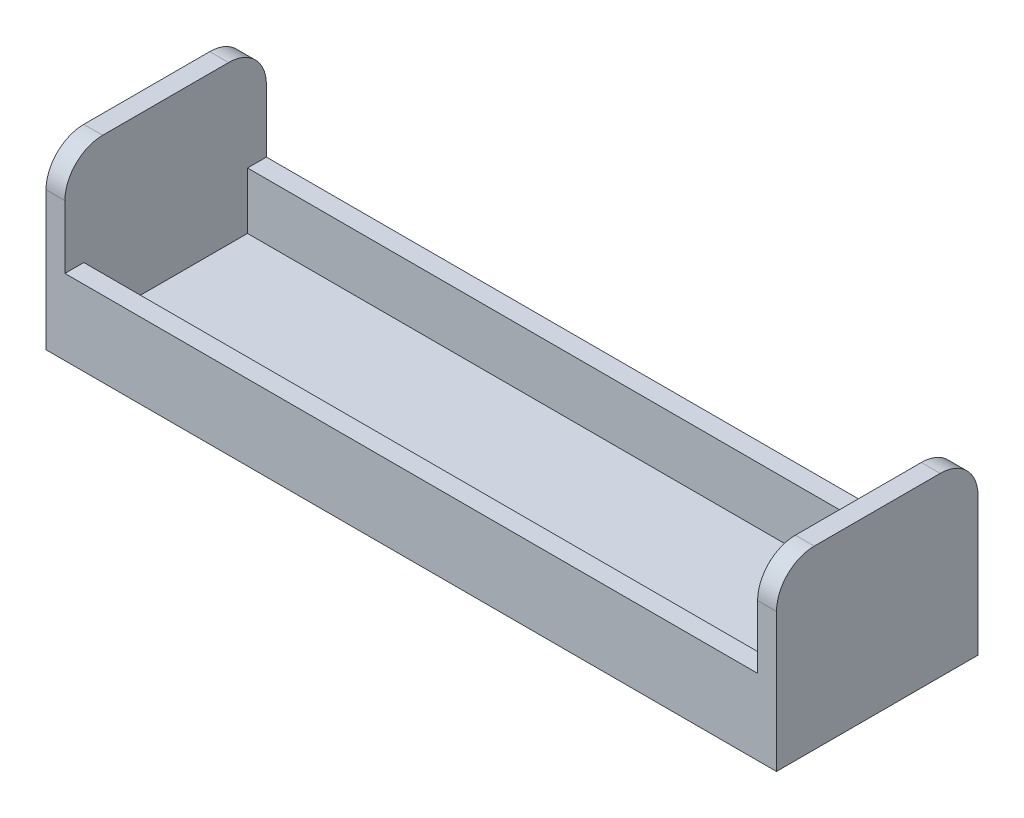
ISO-10303-21;
HEADER;
FILE_DESCRIPTION(('STEP AP214'),'2;1');
FILE_NAME('part.step','',(''),(''),'','','');
FILE_SCHEMA(('AUTOMOTIVE_DESIGN { 1 0 10303 214 1 1 1 1 }'));
ENDSEC;
DATA;
#1=APPLICATION_CONTEXT('core data for automotive mechanical design processes');
#2=APPLICATION_PROTOCOL_DEFINITION('international standard','automotive_design',2000,#1);
#3=PRODUCT_CONTEXT('',#1,'mechanical');
#4=PRODUCT('Part','Part','',(#3));
#5=PRODUCT_RELATED_PRODUCT_CATEGORY('part','',(#4));
#6=PRODUCT_DEFINITION_FORMATION('','',#4);
#7=PRODUCT_DEFINITION_CONTEXT('part definition',#1,'design');
#8=PRODUCT_DEFINITION('design','',#6,#7);
#9=PRODUCT_DEFINITION_SHAPE('','',#8);
#10=(LENGTH_UNIT() NAMED_UNIT(*) SI_UNIT(.MILLI.,.METRE.));
#11=(NAMED_UNIT(*) PLANE_ANGLE_UNIT() SI_UNIT($,.RADIAN.));
#12=(NAMED_UNIT(*) SI_UNIT($,.STERADIAN.) SOLID_ANGLE_UNIT());
#13=UNCERTAINTY_MEASURE_WITH_UNIT(LENGTH_MEASURE(1.E-05),#10,'distance_accuracy_value','');
#14=(GEOMETRIC_REPRESENTATION_CONTEXT(3) GLOBAL_UNCERTAINTY_ASSIGNED_CONTEXT((#13)) GLOBAL_UNIT_ASSIGNED_CONTEXT((#10,
#11,#12)) REPRESENTATION_CONTEXT('',''));
#15=CARTESIAN_POINT('',(0.,0.,0.));
#16=DIRECTION('',(0.,0.,1.));
#17=DIRECTION('',(1.,0.,0.));
#18=AXIS2_PLACEMENT_3D('',#15,#16,#17);
#19=CARTESIAN_POINT('',(27.5,6.,-8.));
#20=DIRECTION('',(0.,-1.,0.));
#21=DIRECTION('',(0.,0.,-1.));
#22=AXIS2_PLACEMENT_3D('',#19,#20,#21);
#23=PLANE('',#22);
#24=DIRECTION('',(0.,0.,1.));
#25=VECTOR('',#24,1.);
#26=CARTESIAN_POINT('',(27.5,6.,-8.));
#27=LINE('',#26,#25);
#28=CARTESIAN_POINT('',(27.5,6.,6.5));
#29=VERTEX_POINT('',#28);
#30=CARTESIAN_POINT('',(27.5,6.,8.));
#31=VERTEX_POINT('',#30);
#32=EDGE_CURVE('E168',#29,#31,#27,.T.);
#33=ORIENTED_EDGE('',*,*,#32,.F.);
#34=DIRECTION('',(1.,0.,0.));
#35=VECTOR('',#34,1.);
#36=CARTESIAN_POINT('',(-27.5,6.,6.5));
#37=LINE('',#36,#35);
#38=CARTESIAN_POINT('',(-27.5,6.,6.5));
#39=VERTEX_POINT('',#38);
#40=EDGE_CURVE('E162',#39,#29,#37,.T.);
#41=ORIENTED_EDGE('',*,*,#40,.F.);
#42=DIRECTION('',(0.,0.,1.));
#43=VECTOR('',#42,1.);
#44=CARTESIAN_POINT('',(-27.5,6.,-8.));
#45=LINE('',#44,#43);
#46=CARTESIAN_POINT('',(-27.5,6.,8.));
#47=VERTEX_POINT('',#46);
#48=EDGE_CURVE('E169',#39,#47,#45,.T.);
#49=ORIENTED_EDGE('',*,*,#48,.T.);
#50=DIRECTION('',(1.,0.,0.));
#51=VECTOR('',#50,1.);
#52=CARTESIAN_POINT('',(27.5,6.,8.));
#53=LINE('',#52,#51);
#54=EDGE_CURVE('E271',#47,#31,#53,.T.);
#55=ORIENTED_EDGE('',*,*,#54,.T.);
#56=EDGE_LOOP('',(#33,#41,#49,#55));
#57=FACE_BOUND('',#56,.T.);
#58=ADVANCED_FACE('F34',(#57),#23,.F.);
#59=CARTESIAN_POINT('',(29.,11.,-5.));
#60=DIRECTION('',(-1.,0.,0.));
#61=DIRECTION('',(0.,0.,1.));
#62=AXIS2_PLACEMENT_3D('',#59,#60,#61);
#63=CYLINDRICAL_SURFACE('',#62,3.);
#64=DIRECTION('',(-1.,0.,0.));
#65=VECTOR('',#64,1.);
#66=CARTESIAN_POINT('',(29.,14.,-5.));
#67=LINE('',#66,#65);
#68=CARTESIAN_POINT('',(-27.5,14.,-5.));
#69=VERTEX_POINT('',#68);
#70=CARTESIAN_POINT('',(-29.,14.,-5.));
#71=VERTEX_POINT('',#70);
#72=EDGE_CURVE('E226',#69,#71,#67,.T.);
#73=ORIENTED_EDGE('',*,*,#72,.F.);
#74=CARTESIAN_POINT('',(-27.5,11.,-5.));
#75=DIRECTION('',(-1.,0.,0.));
#76=DIRECTION('',(0.,0.,1.));
#77=AXIS2_PLACEMENT_3D('',#74,#75,#76);
#78=CIRCLE('',#77,3.);
#79=CARTESIAN_POINT('',(-27.5,11.,-8.));
#80=VERTEX_POINT('',#79);
#81=EDGE_CURVE('E185',#69,#80,#78,.T.);
#82=ORIENTED_EDGE('',*,*,#81,.T.);
#83=DIRECTION('',(-1.,0.,0.));
#84=VECTOR('',#83,1.);
#85=CARTESIAN_POINT('',(29.,11.,-8.));
#86=LINE('',#85,#84);
#87=CARTESIAN_POINT('',(-29.,11.,-8.));
#88=VERTEX_POINT('',#87);
#89=EDGE_CURVE('E230',#80,#88,#86,.T.);
#90=ORIENTED_EDGE('',*,*,#89,.T.);
#91=CARTESIAN_POINT('',(-29.,11.,-5.));
#92=DIRECTION('',(1.,0.,0.));
#93=DIRECTION('',(0.,0.,1.));
#94=AXIS2_PLACEMENT_3D('',#91,#92,#93);
#95=CIRCLE('',#94,3.);
#96=EDGE_CURVE('E211',#88,#71,#95,.T.);
#97=ORIENTED_EDGE('',*,*,#96,.T.);
#98=EDGE_LOOP('',(#73,#82,#90,#97));
#99=FACE_BOUND('',#98,.T.);
#100=ADVANCED_FACE('F316',(#99),#63,.T.);
#101=CARTESIAN_POINT('',(29.,14.,5.));
#102=DIRECTION('',(0.,-1.,0.));
#103=DIRECTION('',(0.,0.,-1.));
#104=AXIS2_PLACEMENT_3D('',#101,#102,#103);
#105=PLANE('',#104);
#106=DIRECTION('',(-1.,0.,0.));
#107=VECTOR('',#106,1.);
#108=CARTESIAN_POINT('',(29.,14.,5.));
#109=LINE('',#108,#107);
#110=CARTESIAN_POINT('',(-27.5,14.,5.));
#111=VERTEX_POINT('',#110);
#112=CARTESIAN_POINT('',(-29.,14.,5.));
#113=VERTEX_POINT('',#112);
#114=EDGE_CURVE('E222',#111,#113,#109,.T.);
#115=ORIENTED_EDGE('',*,*,#114,.F.);
#116=DIRECTION('',(0.,0.,-1.));
#117=VECTOR('',#116,1.);
#118=CARTESIAN_POINT('',(-27.5,14.,5.));
#119=LINE('',#118,#117);
#120=EDGE_CURVE('E182',#111,#69,#119,.T.);
#121=ORIENTED_EDGE('',*,*,#120,.T.);
#122=ORIENTED_EDGE('',*,*,#72,.T.);
#123=DIRECTION('',(0.,0.,1.));
#124=VECTOR('',#123,1.);
#125=CARTESIAN_POINT('',(-29.,14.,5.));
#126=LINE('',#125,#124);
#127=EDGE_CURVE('E214',#71,#113,#126,.T.);
#128=ORIENTED_EDGE('',*,*,#127,.T.);
#129=EDGE_LOOP('',(#115,#121,#122,#128));
#130=FACE_BOUND('',#129,.T.);
#131=ADVANCED_FACE('F318',(#130),#105,.F.);
#132=CARTESIAN_POINT('',(29.,11.,5.));
#133=DIRECTION('',(-1.,0.,0.));
#134=DIRECTION('',(0.,0.,1.));
#135=AXIS2_PLACEMENT_3D('',#132,#133,#134);
#136=CYLINDRICAL_SURFACE('',#135,3.);
#137=DIRECTION('',(-1.,0.,0.));
#138=VECTOR('',#137,1.);
#139=CARTESIAN_POINT('',(29.,11.,8.));
#140=LINE('',#139,#138);
#141=CARTESIAN_POINT('',(-27.5,11.,8.));
#142=VERTEX_POINT('',#141);
#143=CARTESIAN_POINT('',(-29.,11.,8.));
#144=VERTEX_POINT('',#143);
#145=EDGE_CURVE('E203',#142,#144,#140,.T.);
#146=ORIENTED_EDGE('',*,*,#145,.F.);
#147=CARTESIAN_POINT('',(-27.5,11.,5.));
#148=DIRECTION('',(-1.,0.,0.));
#149=DIRECTION('',(0.,0.,1.));
#150=AXIS2_PLACEMENT_3D('',#147,#148,#149);
#151=CIRCLE('',#150,3.);
#152=EDGE_CURVE('E12',#142,#111,#151,.T.);
#153=ORIENTED_EDGE('',*,*,#152,.T.);
#154=ORIENTED_EDGE('',*,*,#114,.T.);
#155=CARTESIAN_POINT('',(-29.,11.,5.));
#156=DIRECTION('',(1.,0.,0.));
#157=DIRECTION('',(0.,0.,1.));
#158=AXIS2_PLACEMENT_3D('',#155,#156,#157);
#159=CIRCLE('',#158,3.);
#160=EDGE_CURVE('E193',#113,#144,#159,.T.);
#161=ORIENTED_EDGE('',*,*,#160,.T.);
#162=EDGE_LOOP('',(#146,#153,#154,#161));
#163=FACE_BOUND('',#162,.T.);
#164=ADVANCED_FACE('F303',(#163),#136,.T.);
#165=CARTESIAN_POINT('',(29.,0.,8.));
#166=DIRECTION('',(0.,0.,-1.));
#167=DIRECTION('',(-1.,0.,0.));
#168=AXIS2_PLACEMENT_3D('',#165,#166,#167);
#169=PLANE('',#168);
#170=ORIENTED_EDGE('',*,*,#54,.F.);
#171=DIRECTION('',(0.,-1.,0.));
#172=VECTOR('',#171,1.);
#173=CARTESIAN_POINT('',(-27.5,6.,8.));
#174=LINE('',#173,#172);
#175=EDGE_CURVE('E274',#142,#47,#174,.T.);
#176=ORIENTED_EDGE('',*,*,#175,.F.);
#177=ORIENTED_EDGE('',*,*,#145,.T.);
#178=DIRECTION('',(0.,-1.,0.));
#179=VECTOR('',#178,1.);
#180=CARTESIAN_POINT('',(-29.,0.,8.));
#181=LINE('',#180,#179);
#182=CARTESIAN_POINT('',(-29.,0.,8.));
#183=VERTEX_POINT('',#182);
#184=EDGE_CURVE('E188',#144,#183,#181,.T.);
#185=ORIENTED_EDGE('',*,*,#184,.T.);
#186=DIRECTION('',(-1.,0.,0.));
#187=VECTOR('',#186,1.);
#188=CARTESIAN_POINT('',(29.,0.,8.));
#189=LINE('',#188,#187);
#190=CARTESIAN_POINT('',(29.,0.,8.));
#191=VERTEX_POINT('',#190);
#192=EDGE_CURVE('E237',#191,#183,#189,.T.);
#193=ORIENTED_EDGE('',*,*,#192,.F.);
#194=DIRECTION('',(0.,-1.,0.));
#195=VECTOR('',#194,1.);
#196=CARTESIAN_POINT('',(29.,0.,8.));
#197=LINE('',#196,#195);
#198=CARTESIAN_POINT('',(29.,11.,8.));
#199=VERTEX_POINT('',#198);
#200=EDGE_CURVE('E189',#199,#191,#197,.T.);
#201=ORIENTED_EDGE('',*,*,#200,.F.);
#202=CARTESIAN_POINT('',(27.5,11.,8.));
#203=VERTEX_POINT('',#202);
#204=EDGE_CURVE('E219',#199,#203,#140,.T.);
#205=ORIENTED_EDGE('',*,*,#204,.T.);
#206=DIRECTION('',(0.,1.,0.));
#207=VECTOR('',#206,1.);
#208=CARTESIAN_POINT('',(27.5,6.,8.));
#209=LINE('',#208,#207);
#210=EDGE_CURVE('E57',#31,#203,#209,.T.);
#211=ORIENTED_EDGE('',*,*,#210,.F.);
#212=EDGE_LOOP('',(#170,#176,#177,#185,#193,#201,#205,#211));
#213=FACE_BOUND('',#212,.T.);
#214=ADVANCED_FACE('F36',(#213),#169,.F.);
#215=CARTESIAN_POINT('',(29.,0.,8.));
#216=DIRECTION('',(0.,1.,0.));
#217=DIRECTION('',(0.,0.,1.));
#218=AXIS2_PLACEMENT_3D('',#215,#216,#217);
#219=PLANE('',#218);
#220=DIRECTION('',(0.,0.,-1.));
#221=VECTOR('',#220,1.);
#222=CARTESIAN_POINT('',(-29.,0.,8.));
#223=LINE('',#222,#221);
#224=CARTESIAN_POINT('',(-29.,0.,-8.));
#225=VERTEX_POINT('',#224);
#226=EDGE_CURVE('E206',#183,#225,#223,.T.);
#227=ORIENTED_EDGE('',*,*,#226,.T.);
#228=DIRECTION('',(-1.,0.,0.));
#229=VECTOR('',#228,1.);
#230=CARTESIAN_POINT('',(29.,0.,-8.));
#231=LINE('',#230,#229);
#232=CARTESIAN_POINT('',(29.,0.,-8.));
#233=VERTEX_POINT('',#232);
#234=EDGE_CURVE('E234',#233,#225,#231,.T.);
#235=ORIENTED_EDGE('',*,*,#234,.F.);
#236=DIRECTION('',(0.,0.,-1.));
#237=VECTOR('',#236,1.);
#238=CARTESIAN_POINT('',(29.,0.,8.));
#239=LINE('',#238,#237);
#240=EDGE_CURVE('E192',#191,#233,#239,.T.);
#241=ORIENTED_EDGE('',*,*,#240,.F.);
#242=ORIENTED_EDGE('',*,*,#192,.T.);
#243=EDGE_LOOP('',(#227,#235,#241,#242));
#244=FACE_BOUND('',#243,.T.);
#245=ADVANCED_FACE('F313',(#244),#219,.F.);
#246=CARTESIAN_POINT('',(29.,0.,-8.));
#247=DIRECTION('',(0.,0.,1.));
#248=DIRECTION('',(1.,0.,0.));
#249=AXIS2_PLACEMENT_3D('',#246,#247,#248);
#250=PLANE('',#249);
#251=ORIENTED_EDGE('',*,*,#89,.F.);
#252=DIRECTION('',(0.,-1.,0.));
#253=VECTOR('',#252,1.);
#254=CARTESIAN_POINT('',(-27.5,6.,-8.));
#255=LINE('',#254,#253);
#256=CARTESIAN_POINT('',(-27.5,6.,-8.));
#257=VERTEX_POINT('',#256);
#258=EDGE_CURVE('E266',#80,#257,#255,.T.);
#259=ORIENTED_EDGE('',*,*,#258,.T.);
#260=DIRECTION('',(1.,0.,0.));
#261=VECTOR('',#260,1.);
#262=CARTESIAN_POINT('',(27.5,6.,-8.));
#263=LINE('',#262,#261);
#264=CARTESIAN_POINT('',(27.5,6.,-8.));
#265=VERTEX_POINT('',#264);
#266=EDGE_CURVE('E166',#257,#265,#263,.T.);
#267=ORIENTED_EDGE('',*,*,#266,.T.);
#268=DIRECTION('',(0.,1.,0.));
#269=VECTOR('',#268,1.);
#270=CARTESIAN_POINT('',(27.5,6.,-8.));
#271=LINE('',#270,#269);
#272=CARTESIAN_POINT('',(27.5,11.,-8.));
#273=VERTEX_POINT('',#272);
#274=EDGE_CURVE('E173',#265,#273,#271,.T.);
#275=ORIENTED_EDGE('',*,*,#274,.T.);
#276=CARTESIAN_POINT('',(29.,11.,-8.));
#277=VERTEX_POINT('',#276);
#278=EDGE_CURVE('E231',#277,#273,#86,.T.);
#279=ORIENTED_EDGE('',*,*,#278,.F.);
#280=DIRECTION('',(0.,1.,0.));
#281=VECTOR('',#280,1.);
#282=CARTESIAN_POINT('',(29.,0.,-8.));
#283=LINE('',#282,#281);
#284=EDGE_CURVE('E195',#233,#277,#283,.T.);
#285=ORIENTED_EDGE('',*,*,#284,.F.);
#286=ORIENTED_EDGE('',*,*,#234,.T.);
#287=DIRECTION('',(0.,1.,0.));
#288=VECTOR('',#287,1.);
#289=CARTESIAN_POINT('',(-29.,0.,-8.));
#290=LINE('',#289,#288);
#291=EDGE_CURVE('E208',#225,#88,#290,.T.);
#292=ORIENTED_EDGE('',*,*,#291,.T.);
#293=EDGE_LOOP('',(#251,#259,#267,#275,#279,#285,#286,#292));
#294=FACE_BOUND('',#293,.T.);
#295=ADVANCED_FACE('F265',(#294),#250,.F.);
#296=ORIENTED_EDGE('',*,*,#278,.T.);
#297=CARTESIAN_POINT('',(27.5,11.,-5.));
#298=DIRECTION('',(1.,0.,0.));
#299=DIRECTION('',(0.,0.,-1.));
#300=AXIS2_PLACEMENT_3D('',#297,#298,#299);
#301=CIRCLE('',#300,3.);
#302=CARTESIAN_POINT('',(27.5,14.,-5.));
#303=VERTEX_POINT('',#302);
#304=EDGE_CURVE('E179',#273,#303,#301,.T.);
#305=ORIENTED_EDGE('',*,*,#304,.T.);
#306=CARTESIAN_POINT('',(29.,14.,-5.));
#307=VERTEX_POINT('',#306);
#308=EDGE_CURVE('E227',#307,#303,#67,.T.);
#309=ORIENTED_EDGE('',*,*,#308,.F.);
#310=CARTESIAN_POINT('',(29.,11.,-5.));
#311=DIRECTION('',(1.,0.,0.));
#312=DIRECTION('',(0.,0.,1.));
#313=AXIS2_PLACEMENT_3D('',#310,#311,#312);
#314=CIRCLE('',#313,3.);
#315=EDGE_CURVE('E197',#277,#307,#314,.T.);
#316=ORIENTED_EDGE('',*,*,#315,.F.);
#317=EDGE_LOOP('',(#296,#305,#309,#316));
#318=FACE_BOUND('',#317,.T.);
#319=ADVANCED_FACE('F260',(#318),#63,.T.);
#320=ORIENTED_EDGE('',*,*,#308,.T.);
#321=DIRECTION('',(0.,0.,1.));
#322=VECTOR('',#321,1.);
#323=CARTESIAN_POINT('',(27.5,14.,5.));
#324=LINE('',#323,#322);
#325=CARTESIAN_POINT('',(27.5,14.,5.));
#326=VERTEX_POINT('',#325);
#327=EDGE_CURVE('E176',#303,#326,#324,.T.);
#328=ORIENTED_EDGE('',*,*,#327,.T.);
#329=CARTESIAN_POINT('',(29.,14.,5.));
#330=VERTEX_POINT('',#329);
#331=EDGE_CURVE('E223',#330,#326,#109,.T.);
#332=ORIENTED_EDGE('',*,*,#331,.F.);
#333=DIRECTION('',(0.,0.,1.));
#334=VECTOR('',#333,1.);
#335=CARTESIAN_POINT('',(29.,14.,5.));
#336=LINE('',#335,#334);
#337=EDGE_CURVE('E199',#307,#330,#336,.T.);
#338=ORIENTED_EDGE('',*,*,#337,.F.);
#339=EDGE_LOOP('',(#320,#328,#332,#338));
#340=FACE_BOUND('',#339,.T.);
#341=ADVANCED_FACE('F255',(#340),#105,.F.);
#342=ORIENTED_EDGE('',*,*,#331,.T.);
#343=CARTESIAN_POINT('',(27.5,11.,5.));
#344=DIRECTION('',(1.,0.,0.));
#345=DIRECTION('',(0.,0.,-1.));
#346=AXIS2_PLACEMENT_3D('',#343,#344,#345);
#347=CIRCLE('',#346,3.);
#348=EDGE_CURVE('E42',#326,#203,#347,.T.);
#349=ORIENTED_EDGE('',*,*,#348,.T.);
#350=ORIENTED_EDGE('',*,*,#204,.F.);
#351=CARTESIAN_POINT('',(29.,11.,5.));
#352=DIRECTION('',(1.,0.,0.));
#353=DIRECTION('',(0.,0.,1.));
#354=AXIS2_PLACEMENT_3D('',#351,#352,#353);
#355=CIRCLE('',#354,3.);
#356=EDGE_CURVE('E201',#330,#199,#355,.T.);
#357=ORIENTED_EDGE('',*,*,#356,.F.);
#358=EDGE_LOOP('',(#342,#349,#350,#357));
#359=FACE_BOUND('',#358,.T.);
#360=ADVANCED_FACE('F241',(#359),#136,.T.);
#361=CARTESIAN_POINT('',(29.,11.,5.));
#362=DIRECTION('',(-1.,0.,0.));
#363=DIRECTION('',(0.,0.,1.));
#364=AXIS2_PLACEMENT_3D('',#361,#362,#363);
#365=PLANE('',#364);
#366=ORIENTED_EDGE('',*,*,#200,.T.);
#367=ORIENTED_EDGE('',*,*,#240,.T.);
#368=ORIENTED_EDGE('',*,*,#284,.T.);
#369=ORIENTED_EDGE('',*,*,#315,.T.);
#370=ORIENTED_EDGE('',*,*,#337,.T.);
#371=ORIENTED_EDGE('',*,*,#356,.T.);
#372=EDGE_LOOP('',(#366,#367,#368,#369,#370,#371));
#373=FACE_BOUND('',#372,.T.);
#374=ADVANCED_FACE('F249',(#373),#365,.F.);
#375=CARTESIAN_POINT('',(-29.,11.,5.));
#376=DIRECTION('',(-1.,0.,0.));
#377=DIRECTION('',(0.,0.,1.));
#378=AXIS2_PLACEMENT_3D('',#375,#376,#377);
#379=PLANE('',#378);
#380=ORIENTED_EDGE('',*,*,#184,.F.);
#381=ORIENTED_EDGE('',*,*,#160,.F.);
#382=ORIENTED_EDGE('',*,*,#127,.F.);
#383=ORIENTED_EDGE('',*,*,#96,.F.);
#384=ORIENTED_EDGE('',*,*,#291,.F.);
#385=ORIENTED_EDGE('',*,*,#226,.F.);
#386=EDGE_LOOP('',(#380,#381,#382,#383,#384,#385));
#387=FACE_BOUND('',#386,.T.);
#388=ADVANCED_FACE('F309',(#387),#379,.T.);
#389=CARTESIAN_POINT('',(-27.5,6.,-8.));
#390=DIRECTION('',(-1.,0.,0.));
#391=DIRECTION('',(0.,0.,1.));
#392=AXIS2_PLACEMENT_3D('',#389,#390,#391);
#393=PLANE('',#392);
#394=ORIENTED_EDGE('',*,*,#120,.F.);
#395=ORIENTED_EDGE('',*,*,#152,.F.);
#396=ORIENTED_EDGE('',*,*,#175,.T.);
#397=ORIENTED_EDGE('',*,*,#48,.F.);
#398=DIRECTION('',(0.,1.,0.));
#399=VECTOR('',#398,1.);
#400=CARTESIAN_POINT('',(-27.5,-56.5154846037792,6.5));
#401=LINE('',#400,#399);
#402=CARTESIAN_POINT('',(-27.5,1.5,6.5));
#403=VERTEX_POINT('',#402);
#404=EDGE_CURVE('E156',#403,#39,#401,.T.);
#405=ORIENTED_EDGE('',*,*,#404,.F.);
#406=DIRECTION('',(0.,0.,-1.));
#407=VECTOR('',#406,1.);
#408=CARTESIAN_POINT('',(-27.5,1.5,6.5));
#409=LINE('',#408,#407);
#410=CARTESIAN_POINT('',(-27.5,1.5,-6.5));
#411=VERTEX_POINT('',#410);
#412=EDGE_CURVE('E154',#403,#411,#409,.T.);
#413=ORIENTED_EDGE('',*,*,#412,.T.);
#414=DIRECTION('',(0.,1.,0.));
#415=VECTOR('',#414,1.);
#416=CARTESIAN_POINT('',(-27.5,-56.5154846037792,-6.5));
#417=LINE('',#416,#415);
#418=CARTESIAN_POINT('',(-27.5,6.,-6.5));
#419=VERTEX_POINT('',#418);
#420=EDGE_CURVE('E147',#411,#419,#417,.T.);
#421=ORIENTED_EDGE('',*,*,#420,.T.);
#422=EDGE_CURVE('E150',#257,#419,#45,.T.);
#423=ORIENTED_EDGE('',*,*,#422,.F.);
#424=ORIENTED_EDGE('',*,*,#258,.F.);
#425=ORIENTED_EDGE('',*,*,#81,.F.);
#426=EDGE_LOOP('',(#394,#395,#396,#397,#405,#413,#421,#423,#424,#425));
#427=FACE_BOUND('',#426,.T.);
#428=ADVANCED_FACE('F148',(#427),#393,.F.);
#429=CARTESIAN_POINT('',(27.5,6.,-8.));
#430=DIRECTION('',(1.,0.,0.));
#431=DIRECTION('',(0.,0.,-1.));
#432=AXIS2_PLACEMENT_3D('',#429,#430,#431);
#433=PLANE('',#432);
#434=ORIENTED_EDGE('',*,*,#274,.F.);
#435=CARTESIAN_POINT('',(27.5,6.,-6.5));
#436=VERTEX_POINT('',#435);
#437=EDGE_CURVE('E171',#265,#436,#27,.T.);
#438=ORIENTED_EDGE('',*,*,#437,.T.);
#439=DIRECTION('',(0.,1.,0.));
#440=VECTOR('',#439,1.);
#441=CARTESIAN_POINT('',(27.5,-56.5154846037792,-6.5));
#442=LINE('',#441,#440);
#443=CARTESIAN_POINT('',(27.5,1.5,-6.5));
#444=VERTEX_POINT('',#443);
#445=EDGE_CURVE('E49',#444,#436,#442,.T.);
#446=ORIENTED_EDGE('',*,*,#445,.F.);
#447=DIRECTION('',(0.,0.,1.));
#448=VECTOR('',#447,1.);
#449=CARTESIAN_POINT('',(27.5,1.5,6.5));
#450=LINE('',#449,#448);
#451=CARTESIAN_POINT('',(27.5,1.5,6.5));
#452=VERTEX_POINT('',#451);
#453=EDGE_CURVE('E279',#444,#452,#450,.T.);
#454=ORIENTED_EDGE('',*,*,#453,.T.);
#455=DIRECTION('',(0.,1.,0.));
#456=VECTOR('',#455,1.);
#457=CARTESIAN_POINT('',(27.5,-56.5154846037792,6.5));
#458=LINE('',#457,#456);
#459=EDGE_CURVE('E282',#452,#29,#458,.T.);
#460=ORIENTED_EDGE('',*,*,#459,.T.);
#461=ORIENTED_EDGE('',*,*,#32,.T.);
#462=ORIENTED_EDGE('',*,*,#210,.T.);
#463=ORIENTED_EDGE('',*,*,#348,.F.);
#464=ORIENTED_EDGE('',*,*,#327,.F.);
#465=ORIENTED_EDGE('',*,*,#304,.F.);
#466=EDGE_LOOP('',(#434,#438,#446,#454,#460,#461,#462,#463,#464,#465));
#467=FACE_BOUND('',#466,.T.);
#468=ADVANCED_FACE('F257',(#467),#433,.F.);
#469=ORIENTED_EDGE('',*,*,#422,.T.);
#470=DIRECTION('',(-1.,0.,0.));
#471=VECTOR('',#470,1.);
#472=CARTESIAN_POINT('',(-27.5,6.,-6.5));
#473=LINE('',#472,#471);
#474=EDGE_CURVE('E158',#436,#419,#473,.T.);
#475=ORIENTED_EDGE('',*,*,#474,.F.);
#476=ORIENTED_EDGE('',*,*,#437,.F.);
#477=ORIENTED_EDGE('',*,*,#266,.F.);
#478=EDGE_LOOP('',(#469,#475,#476,#477));
#479=FACE_BOUND('',#478,.T.);
#480=ADVANCED_FACE('F164',(#479),#23,.F.);
#481=CARTESIAN_POINT('',(-27.5,-56.5154846037792,6.5));
#482=DIRECTION('',(0.,0.,1.));
#483=DIRECTION('',(1.,0.,0.));
#484=AXIS2_PLACEMENT_3D('',#481,#482,#483);
#485=PLANE('',#484);
#486=DIRECTION('',(-1.,0.,0.));
#487=VECTOR('',#486,1.);
#488=CARTESIAN_POINT('',(-27.5,1.5,6.5));
#489=LINE('',#488,#487);
#490=EDGE_CURVE('E287',#452,#403,#489,.T.);
#491=ORIENTED_EDGE('',*,*,#490,.T.);
#492=ORIENTED_EDGE('',*,*,#404,.T.);
#493=ORIENTED_EDGE('',*,*,#40,.T.);
#494=ORIENTED_EDGE('',*,*,#459,.F.);
#495=EDGE_LOOP('',(#491,#492,#493,#494));
#496=FACE_BOUND('',#495,.T.);
#497=ADVANCED_FACE('F292',(#496),#485,.F.);
#498=CARTESIAN_POINT('',(-27.5,-56.5154846037792,-6.5));
#499=DIRECTION('',(0.,0.,-1.));
#500=DIRECTION('',(-1.,0.,0.));
#501=AXIS2_PLACEMENT_3D('',#498,#499,#500);
#502=PLANE('',#501);
#503=DIRECTION('',(1.,0.,0.));
#504=VECTOR('',#503,1.);
#505=CARTESIAN_POINT('',(-27.5,1.5,-6.5));
#506=LINE('',#505,#504);
#507=EDGE_CURVE('E277',#411,#444,#506,.T.);
#508=ORIENTED_EDGE('',*,*,#507,.T.);
#509=ORIENTED_EDGE('',*,*,#445,.T.);
#510=ORIENTED_EDGE('',*,*,#474,.T.);
#511=ORIENTED_EDGE('',*,*,#420,.F.);
#512=EDGE_LOOP('',(#508,#509,#510,#511));
#513=FACE_BOUND('',#512,.T.);
#514=ADVANCED_FACE('F159',(#513),#502,.F.);
#515=CARTESIAN_POINT('',(29.,1.5,8.));
#516=DIRECTION('',(0.,1.,0.));
#517=DIRECTION('',(0.,0.,1.));
#518=AXIS2_PLACEMENT_3D('',#515,#516,#517);
#519=PLANE('',#518);
#520=ORIENTED_EDGE('',*,*,#453,.F.);
#521=ORIENTED_EDGE('',*,*,#507,.F.);
#522=ORIENTED_EDGE('',*,*,#412,.F.);
#523=ORIENTED_EDGE('',*,*,#490,.F.);
#524=EDGE_LOOP('',(#520,#521,#522,#523));
#525=FACE_BOUND('',#524,.T.);
#526=ADVANCED_FACE('F296',(#525),#519,.T.);
#527=CLOSED_SHELL('',(#58,#100,#131,#164,#214,#245,#295,#319,#341,#360,#374,#388,#428,#468,#480,
#497,#514,#526));
#528=MANIFOLD_SOLID_BREP('B2',#527);
#529=ADVANCED_BREP_SHAPE_REPRESENTATION('',(#18,#528),#14);
#530=SHAPE_DEFINITION_REPRESENTATION(#9,#529);
ENDSEC;
END-ISO-10303-21;
